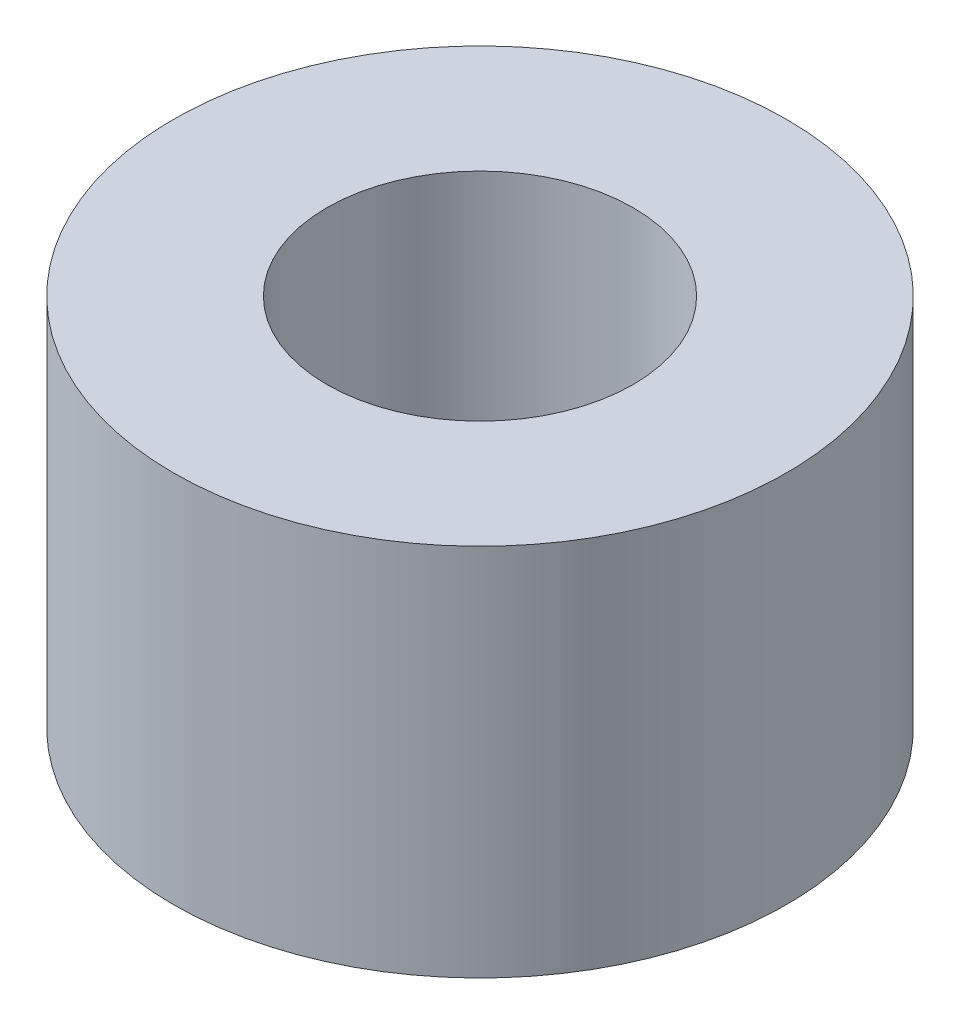
ISO-10303-21;
HEADER;
FILE_DESCRIPTION(('STEP AP214'),'2;1');
FILE_NAME('part.step','',(''),(''),'','','');
FILE_SCHEMA(('AUTOMOTIVE_DESIGN { 1 0 10303 214 1 1 1 1 }'));
ENDSEC;
DATA;
#1=APPLICATION_CONTEXT('core data for automotive mechanical design processes');
#2=APPLICATION_PROTOCOL_DEFINITION('international standard','automotive_design',2000,#1);
#3=PRODUCT_CONTEXT('',#1,'mechanical');
#4=PRODUCT('Part','Part','',(#3));
#5=PRODUCT_RELATED_PRODUCT_CATEGORY('part','',(#4));
#6=PRODUCT_DEFINITION_FORMATION('','',#4);
#7=PRODUCT_DEFINITION_CONTEXT('part definition',#1,'design');
#8=PRODUCT_DEFINITION('design','',#6,#7);
#9=PRODUCT_DEFINITION_SHAPE('','',#8);
#10=(LENGTH_UNIT() NAMED_UNIT(*) SI_UNIT(.MILLI.,.METRE.));
#11=(NAMED_UNIT(*) PLANE_ANGLE_UNIT() SI_UNIT($,.RADIAN.));
#12=(NAMED_UNIT(*) SI_UNIT($,.STERADIAN.) SOLID_ANGLE_UNIT());
#13=UNCERTAINTY_MEASURE_WITH_UNIT(LENGTH_MEASURE(1.E-05),#10,'distance_accuracy_value','');
#14=(GEOMETRIC_REPRESENTATION_CONTEXT(3) GLOBAL_UNCERTAINTY_ASSIGNED_CONTEXT((#13)) GLOBAL_UNIT_ASSIGNED_CONTEXT((#10,
#11,#12)) REPRESENTATION_CONTEXT('',''));
#15=CARTESIAN_POINT('',(0.,0.,0.));
#16=DIRECTION('',(0.,0.,1.));
#17=DIRECTION('',(1.,0.,0.));
#18=AXIS2_PLACEMENT_3D('',#15,#16,#17);
#19=CARTESIAN_POINT('',(0.,31.,0.));
#20=DIRECTION('',(0.,1.,0.));
#21=DIRECTION('',(0.,0.,1.));
#22=AXIS2_PLACEMENT_3D('',#19,#20,#21);
#23=PLANE('',#22);
#24=CARTESIAN_POINT('',(0.,31.,0.));
#25=DIRECTION('',(0.,1.,0.));
#26=DIRECTION('',(0.,0.,1.));
#27=AXIS2_PLACEMENT_3D('',#24,#25,#26);
#28=CIRCLE('',#27,25.4);
#29=CARTESIAN_POINT('',(0.,31.,25.4));
#30=VERTEX_POINT('',#29);
#31=EDGE_CURVE('E10',#30,#30,#28,.T.);
#32=ORIENTED_EDGE('',*,*,#31,.T.);
#33=EDGE_LOOP('',(#32));
#34=FACE_BOUND('',#33,.T.);
#35=CARTESIAN_POINT('',(0.,31.,0.));
#36=DIRECTION('',(0.,1.,0.));
#37=DIRECTION('',(0.,0.,1.));
#38=AXIS2_PLACEMENT_3D('',#35,#36,#37);
#39=CIRCLE('',#38,12.7);
#40=CARTESIAN_POINT('',(0.,31.,12.7));
#41=VERTEX_POINT('',#40);
#42=EDGE_CURVE('E42',#41,#41,#39,.T.);
#43=ORIENTED_EDGE('',*,*,#42,.F.);
#44=EDGE_LOOP('',(#43));
#45=FACE_BOUND('',#44,.T.);
#46=ADVANCED_FACE('F31',(#34,#45),#23,.T.);
#47=CARTESIAN_POINT('',(0.,0.,0.));
#48=DIRECTION('',(0.,1.,0.));
#49=DIRECTION('',(0.,0.,1.));
#50=AXIS2_PLACEMENT_3D('',#47,#48,#49);
#51=PLANE('',#50);
#52=CARTESIAN_POINT('',(0.,0.,0.));
#53=DIRECTION('',(0.,1.,0.));
#54=DIRECTION('',(0.,0.,1.));
#55=AXIS2_PLACEMENT_3D('',#52,#53,#54);
#56=CIRCLE('',#55,25.4);
#57=CARTESIAN_POINT('',(0.,0.,25.4));
#58=VERTEX_POINT('',#57);
#59=EDGE_CURVE('E35',#58,#58,#56,.T.);
#60=ORIENTED_EDGE('',*,*,#59,.F.);
#61=EDGE_LOOP('',(#60));
#62=FACE_BOUND('',#61,.T.);
#63=CARTESIAN_POINT('',(0.,0.,0.));
#64=DIRECTION('',(0.,1.,0.));
#65=DIRECTION('',(0.,0.,1.));
#66=AXIS2_PLACEMENT_3D('',#63,#64,#65);
#67=CIRCLE('',#66,12.7);
#68=CARTESIAN_POINT('',(0.,0.,12.7));
#69=VERTEX_POINT('',#68);
#70=EDGE_CURVE('E44',#69,#69,#67,.T.);
#71=ORIENTED_EDGE('',*,*,#70,.T.);
#72=EDGE_LOOP('',(#71));
#73=FACE_BOUND('',#72,.T.);
#74=ADVANCED_FACE('F54',(#62,#73),#51,.F.);
#75=CARTESIAN_POINT('',(0.,31.,0.));
#76=DIRECTION('',(0.,-1.,0.));
#77=DIRECTION('',(0.,0.,-1.));
#78=AXIS2_PLACEMENT_3D('',#75,#76,#77);
#79=CYLINDRICAL_SURFACE('',#78,25.4);
#80=ORIENTED_EDGE('',*,*,#31,.F.);
#81=EDGE_LOOP('',(#80));
#82=FACE_BOUND('',#81,.T.);
#83=ORIENTED_EDGE('',*,*,#59,.T.);
#84=EDGE_LOOP('',(#83));
#85=FACE_BOUND('',#84,.T.);
#86=ADVANCED_FACE('F33',(#82,#85),#79,.T.);
#87=CARTESIAN_POINT('',(0.,31.,0.));
#88=DIRECTION('',(0.,-1.,0.));
#89=DIRECTION('',(0.,0.,-1.));
#90=AXIS2_PLACEMENT_3D('',#87,#88,#89);
#91=CYLINDRICAL_SURFACE('',#90,12.7);
#92=ORIENTED_EDGE('',*,*,#42,.T.);
#93=EDGE_LOOP('',(#92));
#94=FACE_BOUND('',#93,.T.);
#95=ORIENTED_EDGE('',*,*,#70,.F.);
#96=EDGE_LOOP('',(#95));
#97=FACE_BOUND('',#96,.T.);
#98=ADVANCED_FACE('F50',(#94,#97),#91,.F.);
#99=CLOSED_SHELL('',(#46,#74,#86,#98));
#100=MANIFOLD_SOLID_BREP('B2',#99);
#101=ADVANCED_BREP_SHAPE_REPRESENTATION('',(#18,#100),#14);
#102=SHAPE_DEFINITION_REPRESENTATION(#9,#101);
ENDSEC;
END-ISO-10303-21;
